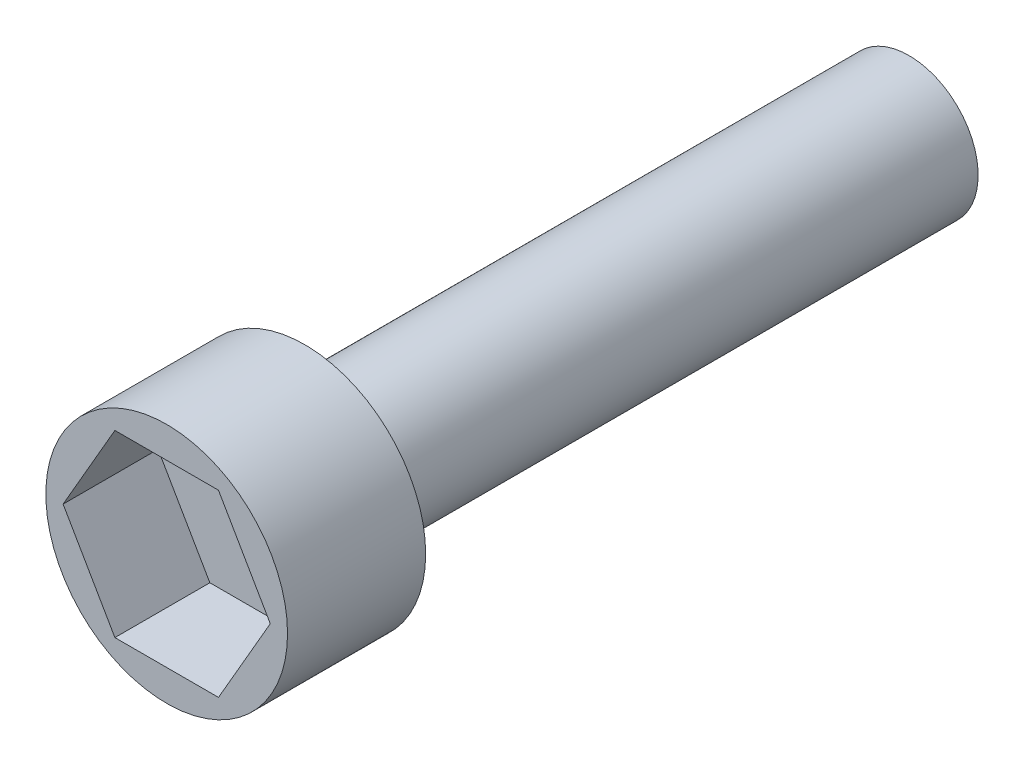
ISO-10303-21;
HEADER;
FILE_DESCRIPTION(('STEP AP214'),'2;1');
FILE_NAME('part.step','',(''),(''),'','','');
FILE_SCHEMA(('AUTOMOTIVE_DESIGN { 1 0 10303 214 1 1 1 1 }'));
ENDSEC;
DATA;
#1=APPLICATION_CONTEXT('core data for automotive mechanical design processes');
#2=APPLICATION_PROTOCOL_DEFINITION('international standard','automotive_design',2000,#1);
#3=PRODUCT_CONTEXT('',#1,'mechanical');
#4=PRODUCT('Part','Part','',(#3));
#5=PRODUCT_RELATED_PRODUCT_CATEGORY('part','',(#4));
#6=PRODUCT_DEFINITION_FORMATION('','',#4);
#7=PRODUCT_DEFINITION_CONTEXT('part definition',#1,'design');
#8=PRODUCT_DEFINITION('design','',#6,#7);
#9=PRODUCT_DEFINITION_SHAPE('','',#8);
#10=(LENGTH_UNIT() NAMED_UNIT(*) SI_UNIT(.MILLI.,.METRE.));
#11=(NAMED_UNIT(*) PLANE_ANGLE_UNIT() SI_UNIT($,.RADIAN.));
#12=(NAMED_UNIT(*) SI_UNIT($,.STERADIAN.) SOLID_ANGLE_UNIT());
#13=UNCERTAINTY_MEASURE_WITH_UNIT(LENGTH_MEASURE(1.E-05),#10,'distance_accuracy_value','');
#14=(GEOMETRIC_REPRESENTATION_CONTEXT(3) GLOBAL_UNCERTAINTY_ASSIGNED_CONTEXT((#13)) GLOBAL_UNIT_ASSIGNED_CONTEXT((#10,
#11,#12)) REPRESENTATION_CONTEXT('',''));
#15=CARTESIAN_POINT('',(0.,0.,0.));
#16=DIRECTION('',(0.,0.,1.));
#17=DIRECTION('',(1.,0.,0.));
#18=AXIS2_PLACEMENT_3D('',#15,#16,#17);
#19=CARTESIAN_POINT('',(0.,0.,889.));
#20=DIRECTION('',(0.,0.,1.));
#21=DIRECTION('',(1.,0.,0.));
#22=AXIS2_PLACEMENT_3D('',#19,#20,#21);
#23=CYLINDRICAL_SURFACE('',#22,177.8);
#24=CARTESIAN_POINT('',(0.,0.,889.));
#25=DIRECTION('',(0.,0.,1.));
#26=DIRECTION('',(1.,0.,0.));
#27=AXIS2_PLACEMENT_3D('',#24,#25,#26);
#28=CIRCLE('',#27,177.8);
#29=CARTESIAN_POINT('',(177.8,0.,889.));
#30=VERTEX_POINT('',#29);
#31=EDGE_CURVE('E35',#30,#30,#28,.T.);
#32=ORIENTED_EDGE('',*,*,#31,.T.);
#33=EDGE_LOOP('',(#32));
#34=FACE_BOUND('',#33,.T.);
#35=CARTESIAN_POINT('',(0.,0.,1092.2));
#36=DIRECTION('',(0.,0.,1.));
#37=DIRECTION('',(1.,0.,0.));
#38=AXIS2_PLACEMENT_3D('',#35,#36,#37);
#39=CIRCLE('',#38,177.8);
#40=CARTESIAN_POINT('',(177.8,0.,1092.2));
#41=VERTEX_POINT('',#40);
#42=EDGE_CURVE('E141',#41,#41,#39,.T.);
#43=ORIENTED_EDGE('',*,*,#42,.F.);
#44=EDGE_LOOP('',(#43));
#45=FACE_BOUND('',#44,.T.);
#46=ADVANCED_FACE('F32',(#34,#45),#23,.T.);
#47=CARTESIAN_POINT('',(177.8,0.,889.));
#48=DIRECTION('',(0.,0.,-1.));
#49=DIRECTION('',(-1.,0.,0.));
#50=AXIS2_PLACEMENT_3D('',#47,#48,#49);
#51=PLANE('',#50);
#52=CARTESIAN_POINT('',(0.,0.,889.));
#53=DIRECTION('',(0.,0.,-1.));
#54=DIRECTION('',(-1.,0.,0.));
#55=AXIS2_PLACEMENT_3D('',#52,#53,#54);
#56=CIRCLE('',#55,101.6);
#57=CARTESIAN_POINT('',(-101.6,0.,889.));
#58=VERTEX_POINT('',#57);
#59=EDGE_CURVE('E11',#58,#58,#56,.T.);
#60=ORIENTED_EDGE('',*,*,#59,.F.);
#61=EDGE_LOOP('',(#60));
#62=FACE_BOUND('',#61,.T.);
#63=ORIENTED_EDGE('',*,*,#31,.F.);
#64=EDGE_LOOP('',(#63));
#65=FACE_BOUND('',#64,.T.);
#66=ADVANCED_FACE('F150',(#62,#65),#51,.T.);
#67=CARTESIAN_POINT('',(0.,0.,1092.2));
#68=DIRECTION('',(0.,0.,1.));
#69=DIRECTION('',(1.,0.,0.));
#70=AXIS2_PLACEMENT_3D('',#67,#68,#69);
#71=PLANE('',#70);
#72=DIRECTION('',(-0.500000000000002,-0.866025403784438,0.));
#73=VECTOR('',#72,1.);
#74=CARTESIAN_POINT('',(-76.1999999999998,131.982271536749,1092.2));
#75=LINE('',#74,#73);
#76=CARTESIAN_POINT('',(-76.1999999999998,131.982271536749,1092.2));
#77=VERTEX_POINT('',#76);
#78=CARTESIAN_POINT('',(-152.4,3.60822483003176E-13,1092.2));
#79=VERTEX_POINT('',#78);
#80=EDGE_CURVE('E47',#77,#79,#75,.T.);
#81=ORIENTED_EDGE('',*,*,#80,.F.);
#82=DIRECTION('',(-1.,0.,0.));
#83=VECTOR('',#82,1.);
#84=CARTESIAN_POINT('',(76.2000000000002,131.982271536748,1092.2));
#85=LINE('',#84,#83);
#86=CARTESIAN_POINT('',(76.2000000000002,131.982271536748,1092.2));
#87=VERTEX_POINT('',#86);
#88=EDGE_CURVE('E130',#87,#77,#85,.T.);
#89=ORIENTED_EDGE('',*,*,#88,.F.);
#90=DIRECTION('',(-0.5,0.866025403784439,0.));
#91=VECTOR('',#90,1.);
#92=CARTESIAN_POINT('',(152.4,0.,1092.2));
#93=LINE('',#92,#91);
#94=CARTESIAN_POINT('',(152.4,0.,1092.2));
#95=VERTEX_POINT('',#94);
#96=EDGE_CURVE('E128',#95,#87,#93,.T.);
#97=ORIENTED_EDGE('',*,*,#96,.F.);
#98=DIRECTION('',(0.500000000000002,0.866025403784437,0.));
#99=VECTOR('',#98,1.);
#100=CARTESIAN_POINT('',(76.1999999999995,-131.982271536749,1092.2));
#101=LINE('',#100,#99);
#102=CARTESIAN_POINT('',(76.1999999999995,-131.982271536749,1092.2));
#103=VERTEX_POINT('',#102);
#104=EDGE_CURVE('E95',#103,#95,#101,.T.);
#105=ORIENTED_EDGE('',*,*,#104,.F.);
#106=DIRECTION('',(1.,0.,0.));
#107=VECTOR('',#106,1.);
#108=CARTESIAN_POINT('',(-76.2000000000005,-131.982271536748,1092.2));
#109=LINE('',#108,#107);
#110=CARTESIAN_POINT('',(-76.2000000000005,-131.982271536748,1092.2));
#111=VERTEX_POINT('',#110);
#112=EDGE_CURVE('E124',#111,#103,#109,.T.);
#113=ORIENTED_EDGE('',*,*,#112,.F.);
#114=DIRECTION('',(0.499999999999998,-0.86602540378444,0.));
#115=VECTOR('',#114,1.);
#116=CARTESIAN_POINT('',(-152.4,3.46944695195361E-13,1092.2));
#117=LINE('',#116,#115);
#118=EDGE_CURVE('E121',#79,#111,#117,.T.);
#119=ORIENTED_EDGE('',*,*,#118,.F.);
#120=EDGE_LOOP('',(#81,#89,#97,#105,#113,#119));
#121=FACE_BOUND('',#120,.T.);
#122=ORIENTED_EDGE('',*,*,#42,.T.);
#123=EDGE_LOOP('',(#122));
#124=FACE_BOUND('',#123,.T.);
#125=ADVANCED_FACE('F152',(#121,#124),#71,.T.);
#126=CARTESIAN_POINT('',(0.,0.,0.));
#127=DIRECTION('',(0.,0.,1.));
#128=DIRECTION('',(1.,0.,0.));
#129=AXIS2_PLACEMENT_3D('',#126,#127,#128);
#130=CYLINDRICAL_SURFACE('',#129,101.6);
#131=CARTESIAN_POINT('',(0.,0.,0.));
#132=DIRECTION('',(0.,0.,-1.));
#133=DIRECTION('',(-1.,0.,0.));
#134=AXIS2_PLACEMENT_3D('',#131,#132,#133);
#135=CIRCLE('',#134,101.6);
#136=CARTESIAN_POINT('',(-101.6,0.,0.));
#137=VERTEX_POINT('',#136);
#138=EDGE_CURVE('E134',#137,#137,#135,.T.);
#139=ORIENTED_EDGE('',*,*,#138,.F.);
#140=EDGE_LOOP('',(#139));
#141=FACE_BOUND('',#140,.T.);
#142=ORIENTED_EDGE('',*,*,#59,.T.);
#143=EDGE_LOOP('',(#142));
#144=FACE_BOUND('',#143,.T.);
#145=ADVANCED_FACE('F158',(#141,#144),#130,.T.);
#146=CARTESIAN_POINT('',(0.,0.,0.));
#147=DIRECTION('',(0.,0.,-1.));
#148=DIRECTION('',(-1.,0.,0.));
#149=AXIS2_PLACEMENT_3D('',#146,#147,#148);
#150=PLANE('',#149);
#151=ORIENTED_EDGE('',*,*,#138,.T.);
#152=EDGE_LOOP('',(#151));
#153=FACE_BOUND('',#152,.T.);
#154=ADVANCED_FACE('F165',(#153),#150,.T.);
#155=CARTESIAN_POINT('',(-76.1999999999998,131.982271536749,952.5));
#156=DIRECTION('',(-0.866025403784438,0.500000000000002,0.));
#157=DIRECTION('',(-0.500000000000002,-0.866025403784438,0.));
#158=AXIS2_PLACEMENT_3D('',#155,#156,#157);
#159=PLANE('',#158);
#160=ORIENTED_EDGE('',*,*,#80,.T.);
#161=DIRECTION('',(0.,0.,1.));
#162=VECTOR('',#161,1.);
#163=CARTESIAN_POINT('',(-152.4,3.46944695195361E-13,952.5));
#164=LINE('',#163,#162);
#165=CARTESIAN_POINT('',(-152.4,3.46944695195361E-13,952.5));
#166=VERTEX_POINT('',#165);
#167=EDGE_CURVE('E77',#166,#79,#164,.T.);
#168=ORIENTED_EDGE('',*,*,#167,.F.);
#169=DIRECTION('',(-0.500000000000002,-0.866025403784438,0.));
#170=VECTOR('',#169,1.);
#171=CARTESIAN_POINT('',(-76.1999999999998,131.982271536749,952.5));
#172=LINE('',#171,#170);
#173=CARTESIAN_POINT('',(-76.1999999999998,131.982271536749,952.5));
#174=VERTEX_POINT('',#173);
#175=EDGE_CURVE('E132',#174,#166,#172,.T.);
#176=ORIENTED_EDGE('',*,*,#175,.F.);
#177=DIRECTION('',(0.,0.,1.));
#178=VECTOR('',#177,1.);
#179=CARTESIAN_POINT('',(-76.1999999999998,131.982271536749,952.5));
#180=LINE('',#179,#178);
#181=EDGE_CURVE('E55',#174,#77,#180,.T.);
#182=ORIENTED_EDGE('',*,*,#181,.T.);
#183=EDGE_LOOP('',(#160,#168,#176,#182));
#184=FACE_BOUND('',#183,.T.);
#185=ADVANCED_FACE('F169',(#184),#159,.F.);
#186=CARTESIAN_POINT('',(76.2000000000002,131.982271536748,952.5));
#187=DIRECTION('',(0.,1.,0.));
#188=DIRECTION('',(-1.,0.,0.));
#189=AXIS2_PLACEMENT_3D('',#186,#187,#188);
#190=PLANE('',#189);
#191=ORIENTED_EDGE('',*,*,#88,.T.);
#192=ORIENTED_EDGE('',*,*,#181,.F.);
#193=DIRECTION('',(-1.,0.,0.));
#194=VECTOR('',#193,1.);
#195=CARTESIAN_POINT('',(76.2000000000002,131.982271536748,952.5));
#196=LINE('',#195,#194);
#197=CARTESIAN_POINT('',(76.2000000000002,131.982271536748,952.5));
#198=VERTEX_POINT('',#197);
#199=EDGE_CURVE('E107',#198,#174,#196,.T.);
#200=ORIENTED_EDGE('',*,*,#199,.F.);
#201=DIRECTION('',(0.,0.,1.));
#202=VECTOR('',#201,1.);
#203=CARTESIAN_POINT('',(76.2000000000002,131.982271536748,952.5));
#204=LINE('',#203,#202);
#205=EDGE_CURVE('E99',#198,#87,#204,.T.);
#206=ORIENTED_EDGE('',*,*,#205,.T.);
#207=EDGE_LOOP('',(#191,#192,#200,#206));
#208=FACE_BOUND('',#207,.T.);
#209=ADVANCED_FACE('F173',(#208),#190,.F.);
#210=CARTESIAN_POINT('',(152.4,0.,952.5));
#211=DIRECTION('',(0.866025403784439,0.5,0.));
#212=DIRECTION('',(-0.5,0.866025403784439,0.));
#213=AXIS2_PLACEMENT_3D('',#210,#211,#212);
#214=PLANE('',#213);
#215=ORIENTED_EDGE('',*,*,#96,.T.);
#216=ORIENTED_EDGE('',*,*,#205,.F.);
#217=DIRECTION('',(-0.5,0.866025403784439,0.));
#218=VECTOR('',#217,1.);
#219=CARTESIAN_POINT('',(152.4,0.,952.5));
#220=LINE('',#219,#218);
#221=CARTESIAN_POINT('',(152.4,0.,952.5));
#222=VERTEX_POINT('',#221);
#223=EDGE_CURVE('E103',#222,#198,#220,.T.);
#224=ORIENTED_EDGE('',*,*,#223,.F.);
#225=DIRECTION('',(0.,0.,1.));
#226=VECTOR('',#225,1.);
#227=CARTESIAN_POINT('',(152.4,0.,952.5));
#228=LINE('',#227,#226);
#229=EDGE_CURVE('E88',#222,#95,#228,.T.);
#230=ORIENTED_EDGE('',*,*,#229,.T.);
#231=EDGE_LOOP('',(#215,#216,#224,#230));
#232=FACE_BOUND('',#231,.T.);
#233=ADVANCED_FACE('F104',(#232),#214,.F.);
#234=CARTESIAN_POINT('',(76.1999999999995,-131.982271536749,952.5));
#235=DIRECTION('',(0.866025403784437,-0.500000000000002,0.));
#236=DIRECTION('',(0.500000000000002,0.866025403784438,0.));
#237=AXIS2_PLACEMENT_3D('',#234,#235,#236);
#238=PLANE('',#237);
#239=ORIENTED_EDGE('',*,*,#104,.T.);
#240=ORIENTED_EDGE('',*,*,#229,.F.);
#241=DIRECTION('',(0.500000000000002,0.866025403784437,0.));
#242=VECTOR('',#241,1.);
#243=CARTESIAN_POINT('',(76.1999999999995,-131.982271536749,952.5));
#244=LINE('',#243,#242);
#245=CARTESIAN_POINT('',(76.1999999999995,-131.982271536749,952.5));
#246=VERTEX_POINT('',#245);
#247=EDGE_CURVE('E92',#246,#222,#244,.T.);
#248=ORIENTED_EDGE('',*,*,#247,.F.);
#249=DIRECTION('',(0.,0.,1.));
#250=VECTOR('',#249,1.);
#251=CARTESIAN_POINT('',(76.1999999999995,-131.982271536749,952.5));
#252=LINE('',#251,#250);
#253=EDGE_CURVE('E100',#246,#103,#252,.T.);
#254=ORIENTED_EDGE('',*,*,#253,.T.);
#255=EDGE_LOOP('',(#239,#240,#248,#254));
#256=FACE_BOUND('',#255,.T.);
#257=ADVANCED_FACE('F90',(#256),#238,.F.);
#258=CARTESIAN_POINT('',(-76.2000000000005,-131.982271536748,952.5));
#259=DIRECTION('',(0.,-1.,0.));
#260=DIRECTION('',(1.,0.,0.));
#261=AXIS2_PLACEMENT_3D('',#258,#259,#260);
#262=PLANE('',#261);
#263=ORIENTED_EDGE('',*,*,#112,.T.);
#264=ORIENTED_EDGE('',*,*,#253,.F.);
#265=DIRECTION('',(1.,0.,0.));
#266=VECTOR('',#265,1.);
#267=CARTESIAN_POINT('',(-76.2000000000005,-131.982271536748,952.5));
#268=LINE('',#267,#266);
#269=CARTESIAN_POINT('',(-76.2000000000005,-131.982271536748,952.5));
#270=VERTEX_POINT('',#269);
#271=EDGE_CURVE('E113',#270,#246,#268,.T.);
#272=ORIENTED_EDGE('',*,*,#271,.F.);
#273=DIRECTION('',(0.,0.,1.));
#274=VECTOR('',#273,1.);
#275=CARTESIAN_POINT('',(-76.2000000000005,-131.982271536748,952.5));
#276=LINE('',#275,#274);
#277=EDGE_CURVE('E137',#270,#111,#276,.T.);
#278=ORIENTED_EDGE('',*,*,#277,.T.);
#279=EDGE_LOOP('',(#263,#264,#272,#278));
#280=FACE_BOUND('',#279,.T.);
#281=ADVANCED_FACE('F177',(#280),#262,.F.);
#282=CARTESIAN_POINT('',(-152.4,3.46944695195361E-13,952.5));
#283=DIRECTION('',(-0.86602540378444,-0.499999999999998,0.));
#284=DIRECTION('',(0.499999999999998,-0.86602540378444,0.));
#285=AXIS2_PLACEMENT_3D('',#282,#283,#284);
#286=PLANE('',#285);
#287=ORIENTED_EDGE('',*,*,#118,.T.);
#288=ORIENTED_EDGE('',*,*,#277,.F.);
#289=DIRECTION('',(0.499999999999998,-0.86602540378444,0.));
#290=VECTOR('',#289,1.);
#291=CARTESIAN_POINT('',(-152.4,3.46944695195361E-13,952.5));
#292=LINE('',#291,#290);
#293=EDGE_CURVE('E115',#166,#270,#292,.T.);
#294=ORIENTED_EDGE('',*,*,#293,.F.);
#295=ORIENTED_EDGE('',*,*,#167,.T.);
#296=EDGE_LOOP('',(#287,#288,#294,#295));
#297=FACE_BOUND('',#296,.T.);
#298=ADVANCED_FACE('F174',(#297),#286,.F.);
#299=CARTESIAN_POINT('',(0.,0.,952.5));
#300=DIRECTION('',(0.,0.,1.));
#301=DIRECTION('',(1.,0.,0.));
#302=AXIS2_PLACEMENT_3D('',#299,#300,#301);
#303=PLANE('',#302);
#304=ORIENTED_EDGE('',*,*,#175,.T.);
#305=ORIENTED_EDGE('',*,*,#293,.T.);
#306=ORIENTED_EDGE('',*,*,#271,.T.);
#307=ORIENTED_EDGE('',*,*,#247,.T.);
#308=ORIENTED_EDGE('',*,*,#223,.T.);
#309=ORIENTED_EDGE('',*,*,#199,.T.);
#310=EDGE_LOOP('',(#304,#305,#306,#307,#308,#309));
#311=FACE_BOUND('',#310,.T.);
#312=ADVANCED_FACE('F110',(#311),#303,.T.);
#313=CLOSED_SHELL('',(#46,#66,#125,#145,#154,#185,#209,#233,#257,#281,#298,#312));
#314=MANIFOLD_SOLID_BREP('B2',#313);
#315=ADVANCED_BREP_SHAPE_REPRESENTATION('',(#18,#314),#14);
#316=SHAPE_DEFINITION_REPRESENTATION(#9,#315);
ENDSEC;
END-ISO-10303-21;
